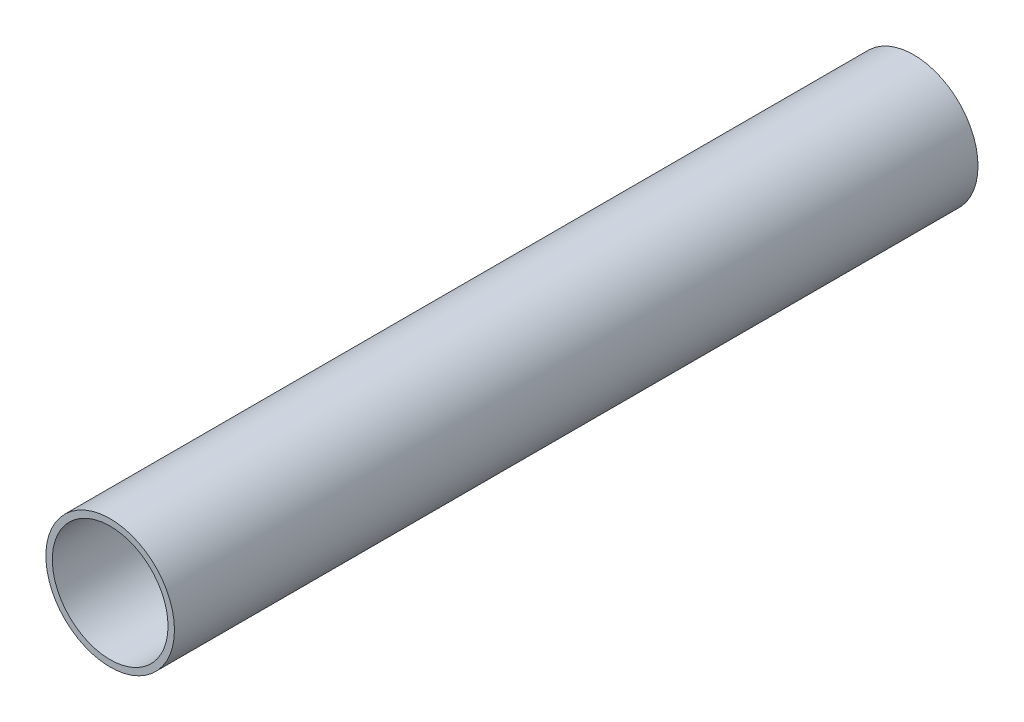
ISO-10303-21;
HEADER;
FILE_DESCRIPTION(('STEP AP214'),'2;1');
FILE_NAME('part.step','',(''),(''),'','','');
FILE_SCHEMA(('AUTOMOTIVE_DESIGN { 1 0 10303 214 1 1 1 1 }'));
ENDSEC;
DATA;
#1=APPLICATION_CONTEXT('core data for automotive mechanical design processes');
#2=APPLICATION_PROTOCOL_DEFINITION('international standard','automotive_design',2000,#1);
#3=PRODUCT_CONTEXT('',#1,'mechanical');
#4=PRODUCT('Part','Part','',(#3));
#5=PRODUCT_RELATED_PRODUCT_CATEGORY('part','',(#4));
#6=PRODUCT_DEFINITION_FORMATION('','',#4);
#7=PRODUCT_DEFINITION_CONTEXT('part definition',#1,'design');
#8=PRODUCT_DEFINITION('design','',#6,#7);
#9=PRODUCT_DEFINITION_SHAPE('','',#8);
#10=(LENGTH_UNIT() NAMED_UNIT(*) SI_UNIT(.MILLI.,.METRE.));
#11=(NAMED_UNIT(*) PLANE_ANGLE_UNIT() SI_UNIT($,.RADIAN.));
#12=(NAMED_UNIT(*) SI_UNIT($,.STERADIAN.) SOLID_ANGLE_UNIT());
#13=UNCERTAINTY_MEASURE_WITH_UNIT(LENGTH_MEASURE(1.E-05),#10,'distance_accuracy_value','');
#14=(GEOMETRIC_REPRESENTATION_CONTEXT(3) GLOBAL_UNCERTAINTY_ASSIGNED_CONTEXT((#13)) GLOBAL_UNIT_ASSIGNED_CONTEXT((#10,
#11,#12)) REPRESENTATION_CONTEXT('',''));
#15=CARTESIAN_POINT('',(0.,0.,0.));
#16=DIRECTION('',(0.,0.,1.));
#17=DIRECTION('',(1.,0.,0.));
#18=AXIS2_PLACEMENT_3D('',#15,#16,#17);
#19=CARTESIAN_POINT('',(0.,0.,250.));
#20=DIRECTION('',(0.,0.,1.));
#21=DIRECTION('',(1.,0.,0.));
#22=AXIS2_PLACEMENT_3D('',#19,#20,#21);
#23=PLANE('',#22);
#24=CARTESIAN_POINT('',(0.,0.,250.));
#25=DIRECTION('',(0.,0.,1.));
#26=DIRECTION('',(1.,0.,0.));
#27=AXIS2_PLACEMENT_3D('',#24,#25,#26);
#28=CIRCLE('',#27,20.);
#29=CARTESIAN_POINT('',(20.,0.,250.));
#30=VERTEX_POINT('',#29);
#31=EDGE_CURVE('E10',#30,#30,#28,.T.);
#32=ORIENTED_EDGE('',*,*,#31,.T.);
#33=EDGE_LOOP('',(#32));
#34=FACE_BOUND('',#33,.T.);
#35=CARTESIAN_POINT('',(0.,0.,250.));
#36=DIRECTION('',(0.,0.,1.));
#37=DIRECTION('',(1.,0.,0.));
#38=AXIS2_PLACEMENT_3D('',#35,#36,#37);
#39=CIRCLE('',#38,18.);
#40=CARTESIAN_POINT('',(18.,0.,250.));
#41=VERTEX_POINT('',#40);
#42=EDGE_CURVE('E43',#41,#41,#39,.T.);
#43=ORIENTED_EDGE('',*,*,#42,.F.);
#44=EDGE_LOOP('',(#43));
#45=FACE_BOUND('',#44,.T.);
#46=ADVANCED_FACE('F32',(#34,#45),#23,.T.);
#47=CARTESIAN_POINT('',(0.,0.,0.));
#48=DIRECTION('',(0.,0.,1.));
#49=DIRECTION('',(1.,0.,0.));
#50=AXIS2_PLACEMENT_3D('',#47,#48,#49);
#51=PLANE('',#50);
#52=CARTESIAN_POINT('',(0.,0.,0.));
#53=DIRECTION('',(0.,0.,1.));
#54=DIRECTION('',(1.,0.,0.));
#55=AXIS2_PLACEMENT_3D('',#52,#53,#54);
#56=CIRCLE('',#55,20.);
#57=CARTESIAN_POINT('',(20.,0.,0.));
#58=VERTEX_POINT('',#57);
#59=EDGE_CURVE('E36',#58,#58,#56,.T.);
#60=ORIENTED_EDGE('',*,*,#59,.F.);
#61=EDGE_LOOP('',(#60));
#62=FACE_BOUND('',#61,.T.);
#63=CARTESIAN_POINT('',(0.,0.,0.));
#64=DIRECTION('',(0.,0.,1.));
#65=DIRECTION('',(1.,0.,0.));
#66=AXIS2_PLACEMENT_3D('',#63,#64,#65);
#67=CIRCLE('',#66,18.);
#68=CARTESIAN_POINT('',(18.,0.,0.));
#69=VERTEX_POINT('',#68);
#70=EDGE_CURVE('E45',#69,#69,#67,.T.);
#71=ORIENTED_EDGE('',*,*,#70,.T.);
#72=EDGE_LOOP('',(#71));
#73=FACE_BOUND('',#72,.T.);
#74=ADVANCED_FACE('F55',(#62,#73),#51,.F.);
#75=CARTESIAN_POINT('',(0.,0.,250.));
#76=DIRECTION('',(0.,0.,-1.));
#77=DIRECTION('',(-1.,0.,0.));
#78=AXIS2_PLACEMENT_3D('',#75,#76,#77);
#79=CYLINDRICAL_SURFACE('',#78,20.);
#80=ORIENTED_EDGE('',*,*,#31,.F.);
#81=EDGE_LOOP('',(#80));
#82=FACE_BOUND('',#81,.T.);
#83=ORIENTED_EDGE('',*,*,#59,.T.);
#84=EDGE_LOOP('',(#83));
#85=FACE_BOUND('',#84,.T.);
#86=ADVANCED_FACE('F34',(#82,#85),#79,.T.);
#87=CARTESIAN_POINT('',(0.,0.,250.));
#88=DIRECTION('',(0.,0.,-1.));
#89=DIRECTION('',(-1.,0.,0.));
#90=AXIS2_PLACEMENT_3D('',#87,#88,#89);
#91=CYLINDRICAL_SURFACE('',#90,18.);
#92=ORIENTED_EDGE('',*,*,#42,.T.);
#93=EDGE_LOOP('',(#92));
#94=FACE_BOUND('',#93,.T.);
#95=ORIENTED_EDGE('',*,*,#70,.F.);
#96=EDGE_LOOP('',(#95));
#97=FACE_BOUND('',#96,.T.);
#98=ADVANCED_FACE('F51',(#94,#97),#91,.F.);
#99=CLOSED_SHELL('',(#46,#74,#86,#98));
#100=MANIFOLD_SOLID_BREP('B2',#99);
#101=ADVANCED_BREP_SHAPE_REPRESENTATION('',(#18,#100),#14);
#102=SHAPE_DEFINITION_REPRESENTATION(#9,#101);
ENDSEC;
END-ISO-10303-21;
